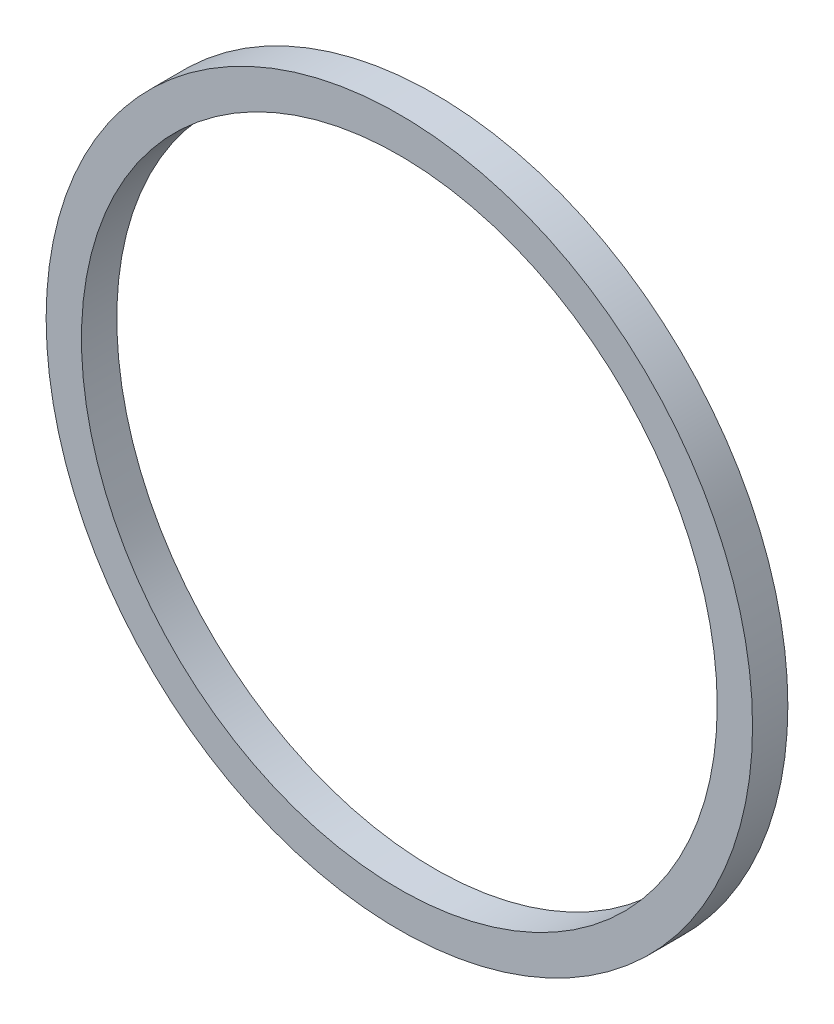
ISO-10303-21;
HEADER;
FILE_DESCRIPTION(('STEP AP214'),'2;1');
FILE_NAME('part.step','',(''),(''),'','','');
FILE_SCHEMA(('AUTOMOTIVE_DESIGN { 1 0 10303 214 1 1 1 1 }'));
ENDSEC;
DATA;
#1=APPLICATION_CONTEXT('core data for automotive mechanical design processes');
#2=APPLICATION_PROTOCOL_DEFINITION('international standard','automotive_design',2000,#1);
#3=PRODUCT_CONTEXT('',#1,'mechanical');
#4=PRODUCT('Part','Part','',(#3));
#5=PRODUCT_RELATED_PRODUCT_CATEGORY('part','',(#4));
#6=PRODUCT_DEFINITION_FORMATION('','',#4);
#7=PRODUCT_DEFINITION_CONTEXT('part definition',#1,'design');
#8=PRODUCT_DEFINITION('design','',#6,#7);
#9=PRODUCT_DEFINITION_SHAPE('','',#8);
#10=(LENGTH_UNIT() NAMED_UNIT(*) SI_UNIT(.MILLI.,.METRE.));
#11=(NAMED_UNIT(*) PLANE_ANGLE_UNIT() SI_UNIT($,.RADIAN.));
#12=(NAMED_UNIT(*) SI_UNIT($,.STERADIAN.) SOLID_ANGLE_UNIT());
#13=UNCERTAINTY_MEASURE_WITH_UNIT(LENGTH_MEASURE(1.E-05),#10,'distance_accuracy_value','');
#14=(GEOMETRIC_REPRESENTATION_CONTEXT(3) GLOBAL_UNCERTAINTY_ASSIGNED_CONTEXT((#13)) GLOBAL_UNIT_ASSIGNED_CONTEXT((#10,
#11,#12)) REPRESENTATION_CONTEXT('',''));
#15=CARTESIAN_POINT('',(0.,0.,0.));
#16=DIRECTION('',(0.,0.,1.));
#17=DIRECTION('',(1.,0.,0.));
#18=AXIS2_PLACEMENT_3D('',#15,#16,#17);
#19=CARTESIAN_POINT('',(0.,0.,-50.8));
#20=DIRECTION('',(0.,0.,1.));
#21=DIRECTION('',(1.,0.,0.));
#22=AXIS2_PLACEMENT_3D('',#19,#20,#21);
#23=CYLINDRICAL_SURFACE('',#22,508.);
#24=CARTESIAN_POINT('',(0.,0.,-50.8));
#25=DIRECTION('',(0.,0.,1.));
#26=DIRECTION('',(1.,0.,0.));
#27=AXIS2_PLACEMENT_3D('',#24,#25,#26);
#28=CIRCLE('',#27,508.);
#29=CARTESIAN_POINT('',(508.,0.,-50.8));
#30=VERTEX_POINT('',#29);
#31=EDGE_CURVE('E10',#30,#30,#28,.T.);
#32=ORIENTED_EDGE('',*,*,#31,.T.);
#33=EDGE_LOOP('',(#32));
#34=FACE_BOUND('',#33,.T.);
#35=CARTESIAN_POINT('',(0.,0.,0.));
#36=DIRECTION('',(0.,0.,1.));
#37=DIRECTION('',(1.,0.,0.));
#38=AXIS2_PLACEMENT_3D('',#35,#36,#37);
#39=CIRCLE('',#38,508.);
#40=CARTESIAN_POINT('',(508.,0.,0.));
#41=VERTEX_POINT('',#40);
#42=EDGE_CURVE('E44',#41,#41,#39,.T.);
#43=ORIENTED_EDGE('',*,*,#42,.F.);
#44=EDGE_LOOP('',(#43));
#45=FACE_BOUND('',#44,.T.);
#46=ADVANCED_FACE('F38',(#34,#45),#23,.T.);
#47=CARTESIAN_POINT('',(0.,0.,-50.8));
#48=DIRECTION('',(0.,0.,1.));
#49=DIRECTION('',(1.,0.,0.));
#50=AXIS2_PLACEMENT_3D('',#47,#48,#49);
#51=PLANE('',#50);
#52=CARTESIAN_POINT('',(0.,0.,-50.8));
#53=DIRECTION('',(0.,0.,1.));
#54=DIRECTION('',(1.,0.,0.));
#55=AXIS2_PLACEMENT_3D('',#52,#53,#54);
#56=CIRCLE('',#55,457.2);
#57=CARTESIAN_POINT('',(457.2,0.,-50.8));
#58=VERTEX_POINT('',#57);
#59=EDGE_CURVE('E48',#58,#58,#56,.T.);
#60=ORIENTED_EDGE('',*,*,#59,.T.);
#61=EDGE_LOOP('',(#60));
#62=FACE_BOUND('',#61,.T.);
#63=ORIENTED_EDGE('',*,*,#31,.F.);
#64=EDGE_LOOP('',(#63));
#65=FACE_BOUND('',#64,.T.);
#66=ADVANCED_FACE('F62',(#62,#65),#51,.F.);
#67=CARTESIAN_POINT('',(0.,0.,0.));
#68=DIRECTION('',(0.,0.,1.));
#69=DIRECTION('',(1.,0.,0.));
#70=AXIS2_PLACEMENT_3D('',#67,#68,#69);
#71=PLANE('',#70);
#72=CARTESIAN_POINT('',(0.,0.,0.));
#73=DIRECTION('',(0.,0.,1.));
#74=DIRECTION('',(1.,0.,0.));
#75=AXIS2_PLACEMENT_3D('',#72,#73,#74);
#76=CIRCLE('',#75,457.2);
#77=CARTESIAN_POINT('',(457.2,0.,0.));
#78=VERTEX_POINT('',#77);
#79=EDGE_CURVE('E52',#78,#78,#76,.T.);
#80=ORIENTED_EDGE('',*,*,#79,.F.);
#81=EDGE_LOOP('',(#80));
#82=FACE_BOUND('',#81,.T.);
#83=ORIENTED_EDGE('',*,*,#42,.T.);
#84=EDGE_LOOP('',(#83));
#85=FACE_BOUND('',#84,.T.);
#86=ADVANCED_FACE('F60',(#82,#85),#71,.T.);
#87=CARTESIAN_POINT('',(0.,0.,-50.8));
#88=DIRECTION('',(0.,0.,1.));
#89=DIRECTION('',(1.,0.,0.));
#90=AXIS2_PLACEMENT_3D('',#87,#88,#89);
#91=CYLINDRICAL_SURFACE('',#90,457.2);
#92=ORIENTED_EDGE('',*,*,#59,.F.);
#93=EDGE_LOOP('',(#92));
#94=FACE_BOUND('',#93,.T.);
#95=ORIENTED_EDGE('',*,*,#79,.T.);
#96=EDGE_LOOP('',(#95));
#97=FACE_BOUND('',#96,.T.);
#98=ADVANCED_FACE('F58',(#94,#97),#91,.F.);
#99=CLOSED_SHELL('',(#46,#66,#86,#98));
#100=MANIFOLD_SOLID_BREP('B2',#99);
#101=ADVANCED_BREP_SHAPE_REPRESENTATION('',(#18,#100),#14);
#102=SHAPE_DEFINITION_REPRESENTATION(#9,#101);
ENDSEC;
END-ISO-10303-21;
